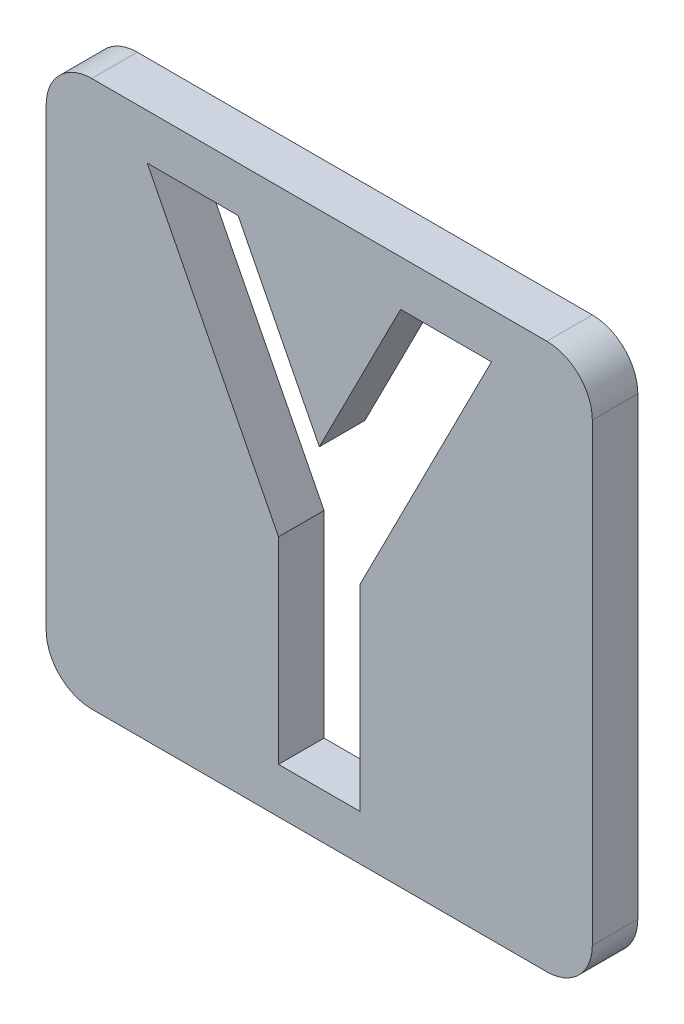
ISO-10303-21;
HEADER;
FILE_DESCRIPTION(('STEP AP214'),'2;1');
FILE_NAME('part.step','',(''),(''),'','','');
FILE_SCHEMA(('AUTOMOTIVE_DESIGN { 1 0 10303 214 1 1 1 1 }'));
ENDSEC;
DATA;
#1=APPLICATION_CONTEXT('core data for automotive mechanical design processes');
#2=APPLICATION_PROTOCOL_DEFINITION('international standard','automotive_design',2000,#1);
#3=PRODUCT_CONTEXT('',#1,'mechanical');
#4=PRODUCT('Part','Part','',(#3));
#5=PRODUCT_RELATED_PRODUCT_CATEGORY('part','',(#4));
#6=PRODUCT_DEFINITION_FORMATION('','',#4);
#7=PRODUCT_DEFINITION_CONTEXT('part definition',#1,'design');
#8=PRODUCT_DEFINITION('design','',#6,#7);
#9=PRODUCT_DEFINITION_SHAPE('','',#8);
#10=(LENGTH_UNIT() NAMED_UNIT(*) SI_UNIT(.MILLI.,.METRE.));
#11=(NAMED_UNIT(*) PLANE_ANGLE_UNIT() SI_UNIT($,.RADIAN.));
#12=(NAMED_UNIT(*) SI_UNIT($,.STERADIAN.) SOLID_ANGLE_UNIT());
#13=UNCERTAINTY_MEASURE_WITH_UNIT(LENGTH_MEASURE(1.E-05),#10,'distance_accuracy_value','');
#14=(GEOMETRIC_REPRESENTATION_CONTEXT(3) GLOBAL_UNCERTAINTY_ASSIGNED_CONTEXT((#13)) GLOBAL_UNIT_ASSIGNED_CONTEXT((#10,
#11,#12)) REPRESENTATION_CONTEXT('',''));
#15=CARTESIAN_POINT('',(0.,0.,0.));
#16=DIRECTION('',(0.,0.,1.));
#17=DIRECTION('',(1.,0.,0.));
#18=AXIS2_PLACEMENT_3D('',#15,#16,#17);
#19=CARTESIAN_POINT('',(50.,50.,10.));
#20=DIRECTION('',(0.,0.,-1.));
#21=DIRECTION('',(-1.,0.,0.));
#22=AXIS2_PLACEMENT_3D('',#19,#20,#21);
#23=PLANE('',#22);
#24=DIRECTION('',(1.,0.,0.));
#25=VECTOR('',#24,1.);
#26=CARTESIAN_POINT('',(-49.9999999999999,60.,10.));
#27=LINE('',#26,#25);
#28=CARTESIAN_POINT('',(-49.9999999999999,60.,10.));
#29=VERTEX_POINT('',#28);
#30=CARTESIAN_POINT('',(49.9999999999999,60.,10.));
#31=VERTEX_POINT('',#30);
#32=EDGE_CURVE('E226',#29,#31,#27,.T.);
#33=ORIENTED_EDGE('',*,*,#32,.F.);
#34=CARTESIAN_POINT('',(-50.,50.,10.));
#35=DIRECTION('',(0.,0.,1.));
#36=DIRECTION('',(1.,0.,0.));
#37=AXIS2_PLACEMENT_3D('',#34,#35,#36);
#38=CIRCLE('',#37,10.);
#39=CARTESIAN_POINT('',(-60.,49.9999999999999,10.));
#40=VERTEX_POINT('',#39);
#41=EDGE_CURVE('E244',#29,#40,#38,.T.);
#42=ORIENTED_EDGE('',*,*,#41,.T.);
#43=DIRECTION('',(0.,-1.,0.));
#44=VECTOR('',#43,1.);
#45=CARTESIAN_POINT('',(-60.,49.9999999999999,10.));
#46=LINE('',#45,#44);
#47=CARTESIAN_POINT('',(-60.,-49.9999999999999,10.));
#48=VERTEX_POINT('',#47);
#49=EDGE_CURVE('E242',#40,#48,#46,.T.);
#50=ORIENTED_EDGE('',*,*,#49,.T.);
#51=CARTESIAN_POINT('',(-50.,-50.,10.));
#52=DIRECTION('',(0.,0.,1.));
#53=DIRECTION('',(1.,0.,0.));
#54=AXIS2_PLACEMENT_3D('',#51,#52,#53);
#55=CIRCLE('',#54,10.);
#56=CARTESIAN_POINT('',(-49.9999999999999,-60.,10.));
#57=VERTEX_POINT('',#56);
#58=EDGE_CURVE('E240',#48,#57,#55,.T.);
#59=ORIENTED_EDGE('',*,*,#58,.T.);
#60=DIRECTION('',(1.,0.,0.));
#61=VECTOR('',#60,1.);
#62=CARTESIAN_POINT('',(-49.9999999999999,-60.,10.));
#63=LINE('',#62,#61);
#64=CARTESIAN_POINT('',(49.9999999999999,-60.,10.));
#65=VERTEX_POINT('',#64);
#66=EDGE_CURVE('E238',#57,#65,#63,.T.);
#67=ORIENTED_EDGE('',*,*,#66,.T.);
#68=CARTESIAN_POINT('',(50.,-50.,10.));
#69=DIRECTION('',(0.,0.,1.));
#70=DIRECTION('',(1.,0.,0.));
#71=AXIS2_PLACEMENT_3D('',#68,#69,#70);
#72=CIRCLE('',#71,10.);
#73=CARTESIAN_POINT('',(60.,-50.,10.));
#74=VERTEX_POINT('',#73);
#75=EDGE_CURVE('E236',#65,#74,#72,.T.);
#76=ORIENTED_EDGE('',*,*,#75,.T.);
#77=DIRECTION('',(0.,-1.,0.));
#78=VECTOR('',#77,1.);
#79=CARTESIAN_POINT('',(60.,49.9999999999999,10.));
#80=LINE('',#79,#78);
#81=CARTESIAN_POINT('',(60.,49.9999999999999,10.));
#82=VERTEX_POINT('',#81);
#83=EDGE_CURVE('E233',#82,#74,#80,.T.);
#84=ORIENTED_EDGE('',*,*,#83,.F.);
#85=CARTESIAN_POINT('',(50.,50.,10.));
#86=DIRECTION('',(0.,0.,-1.));
#87=DIRECTION('',(-1.,0.,0.));
#88=AXIS2_PLACEMENT_3D('',#85,#86,#87);
#89=CIRCLE('',#88,10.);
#90=EDGE_CURVE('E229',#31,#82,#89,.T.);
#91=ORIENTED_EDGE('',*,*,#90,.F.);
#92=EDGE_LOOP('',(#33,#42,#50,#59,#67,#76,#84,#91));
#93=FACE_BOUND('',#92,.T.);
#94=DIRECTION('',(-0.453501133357851,0.891255699585222,0.));
#95=VECTOR('',#94,1.);
#96=CARTESIAN_POINT('',(-8.94871794871795,-6.69070512820513,10.));
#97=LINE('',#96,#95);
#98=CARTESIAN_POINT('',(-8.94871794871795,-6.69070512820513,10.));
#99=VERTEX_POINT('',#98);
#100=CARTESIAN_POINT('',(-37.7948717948718,50.,10.));
#101=VERTEX_POINT('',#100);
#102=EDGE_CURVE('E50',#99,#101,#97,.T.);
#103=ORIENTED_EDGE('',*,*,#102,.T.);
#104=DIRECTION('',(1.,0.,0.));
#105=VECTOR('',#104,1.);
#106=CARTESIAN_POINT('',(-37.7948717948718,50.,10.));
#107=LINE('',#106,#105);
#108=CARTESIAN_POINT('',(-17.8229166666667,50.,10.));
#109=VERTEX_POINT('',#108);
#110=EDGE_CURVE('E168',#101,#109,#107,.T.);
#111=ORIENTED_EDGE('',*,*,#110,.T.);
#112=DIRECTION('',(0.453513991318912,-0.891249156901699,0.));
#113=VECTOR('',#112,1.);
#114=CARTESIAN_POINT('',(-17.8229166666667,50.,10.));
#115=LINE('',#114,#113);
#116=CARTESIAN_POINT('',(0.0256410256410239,14.9238782051282,10.));
#117=VERTEX_POINT('',#116);
#118=EDGE_CURVE('E193',#109,#117,#115,.T.);
#119=ORIENTED_EDGE('',*,*,#118,.T.);
#120=DIRECTION('',(0.453513991318912,0.891249156901699,0.));
#121=VECTOR('',#120,1.);
#122=CARTESIAN_POINT('',(0.0256410256410239,14.9238782051282,10.));
#123=LINE('',#122,#121);
#124=CARTESIAN_POINT('',(17.8741987179487,50.,10.));
#125=VERTEX_POINT('',#124);
#126=EDGE_CURVE('E196',#117,#125,#123,.T.);
#127=ORIENTED_EDGE('',*,*,#126,.T.);
#128=DIRECTION('',(1.,0.,0.));
#129=VECTOR('',#128,1.);
#130=CARTESIAN_POINT('',(17.8741987179487,50.,10.));
#131=LINE('',#130,#129);
#132=CARTESIAN_POINT('',(37.8461538461538,50.,10.));
#133=VERTEX_POINT('',#132);
#134=EDGE_CURVE('E199',#125,#133,#131,.T.);
#135=ORIENTED_EDGE('',*,*,#134,.T.);
#136=DIRECTION('',(-0.453501133357851,-0.891255699585222,0.));
#137=VECTOR('',#136,1.);
#138=CARTESIAN_POINT('',(37.8461538461538,50.,10.));
#139=LINE('',#138,#137);
#140=CARTESIAN_POINT('',(9.,-6.69070512820513,10.));
#141=VERTEX_POINT('',#140);
#142=EDGE_CURVE('E202',#133,#141,#139,.T.);
#143=ORIENTED_EDGE('',*,*,#142,.T.);
#144=DIRECTION('',(0.,-1.,0.));
#145=VECTOR('',#144,1.);
#146=CARTESIAN_POINT('',(9.,-6.69070512820513,10.));
#147=LINE('',#146,#145);
#148=CARTESIAN_POINT('',(9.,-50.,10.));
#149=VERTEX_POINT('',#148);
#150=EDGE_CURVE('E205',#141,#149,#147,.T.);
#151=ORIENTED_EDGE('',*,*,#150,.T.);
#152=DIRECTION('',(-1.,0.,0.));
#153=VECTOR('',#152,1.);
#154=CARTESIAN_POINT('',(9.,-50.,10.));
#155=LINE('',#154,#153);
#156=CARTESIAN_POINT('',(-8.94871794871795,-50.,10.));
#157=VERTEX_POINT('',#156);
#158=EDGE_CURVE('E208',#149,#157,#155,.T.);
#159=ORIENTED_EDGE('',*,*,#158,.T.);
#160=DIRECTION('',(0.,1.,0.));
#161=VECTOR('',#160,1.);
#162=CARTESIAN_POINT('',(-8.94871794871795,-50.,10.));
#163=LINE('',#162,#161);
#164=EDGE_CURVE('E162',#157,#99,#163,.T.);
#165=ORIENTED_EDGE('',*,*,#164,.T.);
#166=EDGE_LOOP('',(#103,#111,#119,#127,#135,#143,#151,#159,#165));
#167=FACE_BOUND('',#166,.T.);
#168=ADVANCED_FACE('F33',(#93,#167),#23,.F.);
#169=CARTESIAN_POINT('',(50.,50.,0.));
#170=DIRECTION('',(0.,0.,-1.));
#171=DIRECTION('',(-1.,0.,0.));
#172=AXIS2_PLACEMENT_3D('',#169,#170,#171);
#173=PLANE('',#172);
#174=DIRECTION('',(1.,0.,0.));
#175=VECTOR('',#174,1.);
#176=CARTESIAN_POINT('',(-49.9999999999999,60.,0.));
#177=LINE('',#176,#175);
#178=CARTESIAN_POINT('',(-49.9999999999999,60.,0.));
#179=VERTEX_POINT('',#178);
#180=CARTESIAN_POINT('',(49.9999999999999,60.,0.));
#181=VERTEX_POINT('',#180);
#182=EDGE_CURVE('E169',#179,#181,#177,.T.);
#183=ORIENTED_EDGE('',*,*,#182,.T.);
#184=CARTESIAN_POINT('',(50.,50.,0.));
#185=DIRECTION('',(0.,0.,-1.));
#186=DIRECTION('',(-1.,0.,0.));
#187=AXIS2_PLACEMENT_3D('',#184,#185,#186);
#188=CIRCLE('',#187,10.);
#189=CARTESIAN_POINT('',(60.,49.9999999999999,0.));
#190=VERTEX_POINT('',#189);
#191=EDGE_CURVE('E248',#181,#190,#188,.T.);
#192=ORIENTED_EDGE('',*,*,#191,.T.);
#193=DIRECTION('',(0.,-1.,0.));
#194=VECTOR('',#193,1.);
#195=CARTESIAN_POINT('',(60.,49.9999999999999,0.));
#196=LINE('',#195,#194);
#197=CARTESIAN_POINT('',(60.,-50.,0.));
#198=VERTEX_POINT('',#197);
#199=EDGE_CURVE('E251',#190,#198,#196,.T.);
#200=ORIENTED_EDGE('',*,*,#199,.T.);
#201=CARTESIAN_POINT('',(50.,-50.,0.));
#202=DIRECTION('',(0.,0.,1.));
#203=DIRECTION('',(1.,0.,0.));
#204=AXIS2_PLACEMENT_3D('',#201,#202,#203);
#205=CIRCLE('',#204,10.);
#206=CARTESIAN_POINT('',(49.9999999999999,-60.,0.));
#207=VERTEX_POINT('',#206);
#208=EDGE_CURVE('E254',#207,#198,#205,.T.);
#209=ORIENTED_EDGE('',*,*,#208,.F.);
#210=DIRECTION('',(1.,0.,0.));
#211=VECTOR('',#210,1.);
#212=CARTESIAN_POINT('',(-49.9999999999999,-60.,0.));
#213=LINE('',#212,#211);
#214=CARTESIAN_POINT('',(-49.9999999999999,-60.,0.));
#215=VERTEX_POINT('',#214);
#216=EDGE_CURVE('E257',#215,#207,#213,.T.);
#217=ORIENTED_EDGE('',*,*,#216,.F.);
#218=CARTESIAN_POINT('',(-50.,-50.,0.));
#219=DIRECTION('',(0.,0.,1.));
#220=DIRECTION('',(1.,0.,0.));
#221=AXIS2_PLACEMENT_3D('',#218,#219,#220);
#222=CIRCLE('',#221,10.);
#223=CARTESIAN_POINT('',(-60.,-49.9999999999999,0.));
#224=VERTEX_POINT('',#223);
#225=EDGE_CURVE('E259',#224,#215,#222,.T.);
#226=ORIENTED_EDGE('',*,*,#225,.F.);
#227=DIRECTION('',(0.,-1.,0.));
#228=VECTOR('',#227,1.);
#229=CARTESIAN_POINT('',(-60.,49.9999999999999,0.));
#230=LINE('',#229,#228);
#231=CARTESIAN_POINT('',(-60.,49.9999999999999,0.));
#232=VERTEX_POINT('',#231);
#233=EDGE_CURVE('E261',#232,#224,#230,.T.);
#234=ORIENTED_EDGE('',*,*,#233,.F.);
#235=CARTESIAN_POINT('',(-50.,50.,0.));
#236=DIRECTION('',(0.,0.,1.));
#237=DIRECTION('',(1.,0.,0.));
#238=AXIS2_PLACEMENT_3D('',#235,#236,#237);
#239=CIRCLE('',#238,10.);
#240=EDGE_CURVE('E230',#179,#232,#239,.T.);
#241=ORIENTED_EDGE('',*,*,#240,.F.);
#242=EDGE_LOOP('',(#183,#192,#200,#209,#217,#226,#234,#241));
#243=FACE_BOUND('',#242,.T.);
#244=DIRECTION('',(1.,0.,0.));
#245=VECTOR('',#244,1.);
#246=CARTESIAN_POINT('',(-37.7948717948718,50.,0.));
#247=LINE('',#246,#245);
#248=CARTESIAN_POINT('',(-37.7948717948718,50.,0.));
#249=VERTEX_POINT('',#248);
#250=CARTESIAN_POINT('',(-17.8229166666667,50.,0.));
#251=VERTEX_POINT('',#250);
#252=EDGE_CURVE('E161',#249,#251,#247,.T.);
#253=ORIENTED_EDGE('',*,*,#252,.F.);
#254=DIRECTION('',(-0.453501133357851,0.891255699585222,0.));
#255=VECTOR('',#254,1.);
#256=CARTESIAN_POINT('',(-8.94871794871795,-6.69070512820513,0.));
#257=LINE('',#256,#255);
#258=CARTESIAN_POINT('',(-8.94871794871795,-6.69070512820513,0.));
#259=VERTEX_POINT('',#258);
#260=EDGE_CURVE('E153',#259,#249,#257,.T.);
#261=ORIENTED_EDGE('',*,*,#260,.F.);
#262=DIRECTION('',(0.,1.,0.));
#263=VECTOR('',#262,1.);
#264=CARTESIAN_POINT('',(-8.94871794871795,-50.,0.));
#265=LINE('',#264,#263);
#266=CARTESIAN_POINT('',(-8.94871794871795,-50.,0.));
#267=VERTEX_POINT('',#266);
#268=EDGE_CURVE('E189',#267,#259,#265,.T.);
#269=ORIENTED_EDGE('',*,*,#268,.F.);
#270=DIRECTION('',(-1.,0.,0.));
#271=VECTOR('',#270,1.);
#272=CARTESIAN_POINT('',(9.,-50.,0.));
#273=LINE('',#272,#271);
#274=CARTESIAN_POINT('',(9.,-50.,0.));
#275=VERTEX_POINT('',#274);
#276=EDGE_CURVE('E187',#275,#267,#273,.T.);
#277=ORIENTED_EDGE('',*,*,#276,.F.);
#278=DIRECTION('',(0.,-1.,0.));
#279=VECTOR('',#278,1.);
#280=CARTESIAN_POINT('',(9.,-6.69070512820513,0.));
#281=LINE('',#280,#279);
#282=CARTESIAN_POINT('',(9.,-6.69070512820513,0.));
#283=VERTEX_POINT('',#282);
#284=EDGE_CURVE('E185',#283,#275,#281,.T.);
#285=ORIENTED_EDGE('',*,*,#284,.F.);
#286=DIRECTION('',(-0.453501133357851,-0.891255699585222,0.));
#287=VECTOR('',#286,1.);
#288=CARTESIAN_POINT('',(37.8461538461538,50.,0.));
#289=LINE('',#288,#287);
#290=CARTESIAN_POINT('',(37.8461538461538,50.,0.));
#291=VERTEX_POINT('',#290);
#292=EDGE_CURVE('E183',#291,#283,#289,.T.);
#293=ORIENTED_EDGE('',*,*,#292,.F.);
#294=DIRECTION('',(1.,0.,0.));
#295=VECTOR('',#294,1.);
#296=CARTESIAN_POINT('',(17.8741987179487,50.,0.));
#297=LINE('',#296,#295);
#298=CARTESIAN_POINT('',(17.8741987179487,50.,0.));
#299=VERTEX_POINT('',#298);
#300=EDGE_CURVE('E181',#299,#291,#297,.T.);
#301=ORIENTED_EDGE('',*,*,#300,.F.);
#302=DIRECTION('',(0.453513991318912,0.891249156901699,0.));
#303=VECTOR('',#302,1.);
#304=CARTESIAN_POINT('',(0.0256410256410239,14.9238782051282,0.));
#305=LINE('',#304,#303);
#306=CARTESIAN_POINT('',(0.0256410256410239,14.9238782051282,0.));
#307=VERTEX_POINT('',#306);
#308=EDGE_CURVE('E177',#307,#299,#305,.T.);
#309=ORIENTED_EDGE('',*,*,#308,.F.);
#310=DIRECTION('',(0.453513991318912,-0.891249156901699,0.));
#311=VECTOR('',#310,1.);
#312=CARTESIAN_POINT('',(-17.8229166666667,50.,0.));
#313=LINE('',#312,#311);
#314=EDGE_CURVE('E175',#251,#307,#313,.T.);
#315=ORIENTED_EDGE('',*,*,#314,.F.);
#316=EDGE_LOOP('',(#253,#261,#269,#277,#285,#293,#301,#309,#315));
#317=FACE_BOUND('',#316,.T.);
#318=ADVANCED_FACE('F173',(#243,#317),#173,.T.);
#319=CARTESIAN_POINT('',(-49.9999999999999,60.,10.));
#320=DIRECTION('',(0.,1.,0.));
#321=DIRECTION('',(0.,0.,1.));
#322=AXIS2_PLACEMENT_3D('',#319,#320,#321);
#323=PLANE('',#322);
#324=ORIENTED_EDGE('',*,*,#182,.F.);
#325=DIRECTION('',(0.,0.,-1.));
#326=VECTOR('',#325,1.);
#327=CARTESIAN_POINT('',(-49.9999999999999,60.,10.));
#328=LINE('',#327,#326);
#329=EDGE_CURVE('E11',#29,#179,#328,.T.);
#330=ORIENTED_EDGE('',*,*,#329,.F.);
#331=ORIENTED_EDGE('',*,*,#32,.T.);
#332=DIRECTION('',(0.,0.,-1.));
#333=VECTOR('',#332,1.);
#334=CARTESIAN_POINT('',(49.9999999999999,60.,10.));
#335=LINE('',#334,#333);
#336=EDGE_CURVE('E37',#31,#181,#335,.T.);
#337=ORIENTED_EDGE('',*,*,#336,.T.);
#338=EDGE_LOOP('',(#324,#330,#331,#337));
#339=FACE_BOUND('',#338,.T.);
#340=ADVANCED_FACE('F35',(#339),#323,.T.);
#341=CARTESIAN_POINT('',(-50.,50.,10.));
#342=DIRECTION('',(0.,0.,-1.));
#343=DIRECTION('',(-1.,0.,0.));
#344=AXIS2_PLACEMENT_3D('',#341,#342,#343);
#345=CYLINDRICAL_SURFACE('',#344,10.);
#346=ORIENTED_EDGE('',*,*,#240,.T.);
#347=DIRECTION('',(0.,0.,-1.));
#348=VECTOR('',#347,1.);
#349=CARTESIAN_POINT('',(-60.,49.9999999999999,10.));
#350=LINE('',#349,#348);
#351=EDGE_CURVE('E42',#40,#232,#350,.T.);
#352=ORIENTED_EDGE('',*,*,#351,.F.);
#353=ORIENTED_EDGE('',*,*,#41,.F.);
#354=ORIENTED_EDGE('',*,*,#329,.T.);
#355=EDGE_LOOP('',(#346,#352,#353,#354));
#356=FACE_BOUND('',#355,.T.);
#357=ADVANCED_FACE('F291',(#356),#345,.T.);
#358=CARTESIAN_POINT('',(-60.,49.9999999999999,10.));
#359=DIRECTION('',(1.,0.,0.));
#360=DIRECTION('',(0.,1.,0.));
#361=AXIS2_PLACEMENT_3D('',#358,#359,#360);
#362=PLANE('',#361);
#363=ORIENTED_EDGE('',*,*,#233,.T.);
#364=DIRECTION('',(0.,0.,-1.));
#365=VECTOR('',#364,1.);
#366=CARTESIAN_POINT('',(-60.,-49.9999999999999,10.));
#367=LINE('',#366,#365);
#368=EDGE_CURVE('E266',#48,#224,#367,.T.);
#369=ORIENTED_EDGE('',*,*,#368,.F.);
#370=ORIENTED_EDGE('',*,*,#49,.F.);
#371=ORIENTED_EDGE('',*,*,#351,.T.);
#372=EDGE_LOOP('',(#363,#369,#370,#371));
#373=FACE_BOUND('',#372,.T.);
#374=ADVANCED_FACE('F295',(#373),#362,.F.);
#375=CARTESIAN_POINT('',(-50.,-50.,10.));
#376=DIRECTION('',(0.,0.,-1.));
#377=DIRECTION('',(-1.,0.,0.));
#378=AXIS2_PLACEMENT_3D('',#375,#376,#377);
#379=CYLINDRICAL_SURFACE('',#378,10.);
#380=ORIENTED_EDGE('',*,*,#225,.T.);
#381=DIRECTION('',(0.,0.,-1.));
#382=VECTOR('',#381,1.);
#383=CARTESIAN_POINT('',(-49.9999999999999,-60.,10.));
#384=LINE('',#383,#382);
#385=EDGE_CURVE('E269',#57,#215,#384,.T.);
#386=ORIENTED_EDGE('',*,*,#385,.F.);
#387=ORIENTED_EDGE('',*,*,#58,.F.);
#388=ORIENTED_EDGE('',*,*,#368,.T.);
#389=EDGE_LOOP('',(#380,#386,#387,#388));
#390=FACE_BOUND('',#389,.T.);
#391=ADVANCED_FACE('F315',(#390),#379,.T.);
#392=CARTESIAN_POINT('',(-49.9999999999999,-60.,10.));
#393=DIRECTION('',(0.,1.,0.));
#394=DIRECTION('',(0.,0.,1.));
#395=AXIS2_PLACEMENT_3D('',#392,#393,#394);
#396=PLANE('',#395);
#397=ORIENTED_EDGE('',*,*,#216,.T.);
#398=DIRECTION('',(0.,0.,-1.));
#399=VECTOR('',#398,1.);
#400=CARTESIAN_POINT('',(49.9999999999999,-60.,10.));
#401=LINE('',#400,#399);
#402=EDGE_CURVE('E272',#65,#207,#401,.T.);
#403=ORIENTED_EDGE('',*,*,#402,.F.);
#404=ORIENTED_EDGE('',*,*,#66,.F.);
#405=ORIENTED_EDGE('',*,*,#385,.T.);
#406=EDGE_LOOP('',(#397,#403,#404,#405));
#407=FACE_BOUND('',#406,.T.);
#408=ADVANCED_FACE('F313',(#407),#396,.F.);
#409=CARTESIAN_POINT('',(50.,-50.,10.));
#410=DIRECTION('',(0.,0.,-1.));
#411=DIRECTION('',(-1.,0.,0.));
#412=AXIS2_PLACEMENT_3D('',#409,#410,#411);
#413=CYLINDRICAL_SURFACE('',#412,10.);
#414=ORIENTED_EDGE('',*,*,#208,.T.);
#415=DIRECTION('',(0.,0.,-1.));
#416=VECTOR('',#415,1.);
#417=CARTESIAN_POINT('',(60.,-50.,10.));
#418=LINE('',#417,#416);
#419=EDGE_CURVE('E275',#74,#198,#418,.T.);
#420=ORIENTED_EDGE('',*,*,#419,.F.);
#421=ORIENTED_EDGE('',*,*,#75,.F.);
#422=ORIENTED_EDGE('',*,*,#402,.T.);
#423=EDGE_LOOP('',(#414,#420,#421,#422));
#424=FACE_BOUND('',#423,.T.);
#425=ADVANCED_FACE('F309',(#424),#413,.T.);
#426=CARTESIAN_POINT('',(60.,49.9999999999999,10.));
#427=DIRECTION('',(1.,0.,0.));
#428=DIRECTION('',(0.,1.,0.));
#429=AXIS2_PLACEMENT_3D('',#426,#427,#428);
#430=PLANE('',#429);
#431=ORIENTED_EDGE('',*,*,#199,.F.);
#432=DIRECTION('',(0.,0.,-1.));
#433=VECTOR('',#432,1.);
#434=CARTESIAN_POINT('',(60.,49.9999999999999,10.));
#435=LINE('',#434,#433);
#436=EDGE_CURVE('E276',#82,#190,#435,.T.);
#437=ORIENTED_EDGE('',*,*,#436,.F.);
#438=ORIENTED_EDGE('',*,*,#83,.T.);
#439=ORIENTED_EDGE('',*,*,#419,.T.);
#440=EDGE_LOOP('',(#431,#437,#438,#439));
#441=FACE_BOUND('',#440,.T.);
#442=ADVANCED_FACE('F305',(#441),#430,.T.);
#443=CARTESIAN_POINT('',(50.,50.,10.));
#444=DIRECTION('',(0.,0.,-1.));
#445=DIRECTION('',(-1.,0.,0.));
#446=AXIS2_PLACEMENT_3D('',#443,#444,#445);
#447=CYLINDRICAL_SURFACE('',#446,10.);
#448=ORIENTED_EDGE('',*,*,#191,.F.);
#449=ORIENTED_EDGE('',*,*,#336,.F.);
#450=ORIENTED_EDGE('',*,*,#90,.T.);
#451=ORIENTED_EDGE('',*,*,#436,.T.);
#452=EDGE_LOOP('',(#448,#449,#450,#451));
#453=FACE_BOUND('',#452,.T.);
#454=ADVANCED_FACE('F284',(#453),#447,.T.);
#455=CARTESIAN_POINT('',(-8.94871794871795,-6.69070512820513,0.));
#456=DIRECTION('',(0.891255699585222,0.453501133357851,0.));
#457=DIRECTION('',(-0.453501133357851,0.891255699585222,0.));
#458=AXIS2_PLACEMENT_3D('',#455,#456,#457);
#459=PLANE('',#458);
#460=ORIENTED_EDGE('',*,*,#102,.F.);
#461=DIRECTION('',(0.,0.,1.));
#462=VECTOR('',#461,1.);
#463=CARTESIAN_POINT('',(-8.94871794871795,-6.69070512820513,0.));
#464=LINE('',#463,#462);
#465=EDGE_CURVE('E157',#259,#99,#464,.T.);
#466=ORIENTED_EDGE('',*,*,#465,.F.);
#467=ORIENTED_EDGE('',*,*,#260,.T.);
#468=DIRECTION('',(0.,0.,1.));
#469=VECTOR('',#468,1.);
#470=CARTESIAN_POINT('',(-37.7948717948718,50.,0.));
#471=LINE('',#470,#469);
#472=EDGE_CURVE('E156',#249,#101,#471,.T.);
#473=ORIENTED_EDGE('',*,*,#472,.T.);
#474=EDGE_LOOP('',(#460,#466,#467,#473));
#475=FACE_BOUND('',#474,.T.);
#476=ADVANCED_FACE('F155',(#475),#459,.T.);
#477=CARTESIAN_POINT('',(-37.7948717948718,50.,0.));
#478=DIRECTION('',(0.,-1.,0.));
#479=DIRECTION('',(0.,0.,-1.));
#480=AXIS2_PLACEMENT_3D('',#477,#478,#479);
#481=PLANE('',#480);
#482=ORIENTED_EDGE('',*,*,#110,.F.);
#483=ORIENTED_EDGE('',*,*,#472,.F.);
#484=ORIENTED_EDGE('',*,*,#252,.T.);
#485=DIRECTION('',(0.,0.,1.));
#486=VECTOR('',#485,1.);
#487=CARTESIAN_POINT('',(-17.8229166666667,50.,0.));
#488=LINE('',#487,#486);
#489=EDGE_CURVE('E170',#251,#109,#488,.T.);
#490=ORIENTED_EDGE('',*,*,#489,.T.);
#491=EDGE_LOOP('',(#482,#483,#484,#490));
#492=FACE_BOUND('',#491,.T.);
#493=ADVANCED_FACE('F165',(#492),#481,.T.);
#494=CARTESIAN_POINT('',(-17.8229166666667,50.,0.));
#495=DIRECTION('',(-0.891249156901699,-0.453513991318912,0.));
#496=DIRECTION('',(0.453513991318912,-0.891249156901699,0.));
#497=AXIS2_PLACEMENT_3D('',#494,#495,#496);
#498=PLANE('',#497);
#499=ORIENTED_EDGE('',*,*,#118,.F.);
#500=ORIENTED_EDGE('',*,*,#489,.F.);
#501=ORIENTED_EDGE('',*,*,#314,.T.);
#502=DIRECTION('',(0.,0.,1.));
#503=VECTOR('',#502,1.);
#504=CARTESIAN_POINT('',(0.0256410256410239,14.9238782051282,0.));
#505=LINE('',#504,#503);
#506=EDGE_CURVE('E223',#307,#117,#505,.T.);
#507=ORIENTED_EDGE('',*,*,#506,.T.);
#508=EDGE_LOOP('',(#499,#500,#501,#507));
#509=FACE_BOUND('',#508,.T.);
#510=ADVANCED_FACE('F364',(#509),#498,.T.);
#511=CARTESIAN_POINT('',(0.0256410256410239,14.9238782051282,0.));
#512=DIRECTION('',(0.891249156901699,-0.453513991318912,0.));
#513=DIRECTION('',(0.453513991318912,0.891249156901699,0.));
#514=AXIS2_PLACEMENT_3D('',#511,#512,#513);
#515=PLANE('',#514);
#516=ORIENTED_EDGE('',*,*,#126,.F.);
#517=ORIENTED_EDGE('',*,*,#506,.F.);
#518=ORIENTED_EDGE('',*,*,#308,.T.);
#519=DIRECTION('',(0.,0.,1.));
#520=VECTOR('',#519,1.);
#521=CARTESIAN_POINT('',(17.8741987179487,50.,0.));
#522=LINE('',#521,#520);
#523=EDGE_CURVE('E221',#299,#125,#522,.T.);
#524=ORIENTED_EDGE('',*,*,#523,.T.);
#525=EDGE_LOOP('',(#516,#517,#518,#524));
#526=FACE_BOUND('',#525,.T.);
#527=ADVANCED_FACE('F372',(#526),#515,.T.);
#528=CARTESIAN_POINT('',(17.8741987179487,50.,0.));
#529=DIRECTION('',(0.,-1.,0.));
#530=DIRECTION('',(0.,0.,-1.));
#531=AXIS2_PLACEMENT_3D('',#528,#529,#530);
#532=PLANE('',#531);
#533=ORIENTED_EDGE('',*,*,#134,.F.);
#534=ORIENTED_EDGE('',*,*,#523,.F.);
#535=ORIENTED_EDGE('',*,*,#300,.T.);
#536=DIRECTION('',(0.,0.,1.));
#537=VECTOR('',#536,1.);
#538=CARTESIAN_POINT('',(37.8461538461538,50.,0.));
#539=LINE('',#538,#537);
#540=EDGE_CURVE('E219',#291,#133,#539,.T.);
#541=ORIENTED_EDGE('',*,*,#540,.T.);
#542=EDGE_LOOP('',(#533,#534,#535,#541));
#543=FACE_BOUND('',#542,.T.);
#544=ADVANCED_FACE('F382',(#543),#532,.T.);
#545=CARTESIAN_POINT('',(37.8461538461538,50.,0.));
#546=DIRECTION('',(-0.891255699585222,0.453501133357851,0.));
#547=DIRECTION('',(-0.453501133357851,-0.891255699585222,0.));
#548=AXIS2_PLACEMENT_3D('',#545,#546,#547);
#549=PLANE('',#548);
#550=ORIENTED_EDGE('',*,*,#142,.F.);
#551=ORIENTED_EDGE('',*,*,#540,.F.);
#552=ORIENTED_EDGE('',*,*,#292,.T.);
#553=DIRECTION('',(0.,0.,1.));
#554=VECTOR('',#553,1.);
#555=CARTESIAN_POINT('',(9.,-6.69070512820513,0.));
#556=LINE('',#555,#554);
#557=EDGE_CURVE('E217',#283,#141,#556,.T.);
#558=ORIENTED_EDGE('',*,*,#557,.T.);
#559=EDGE_LOOP('',(#550,#551,#552,#558));
#560=FACE_BOUND('',#559,.T.);
#561=ADVANCED_FACE('F392',(#560),#549,.T.);
#562=CARTESIAN_POINT('',(9.,-6.69070512820513,0.));
#563=DIRECTION('',(-1.,0.,0.));
#564=DIRECTION('',(0.,0.,1.));
#565=AXIS2_PLACEMENT_3D('',#562,#563,#564);
#566=PLANE('',#565);
#567=ORIENTED_EDGE('',*,*,#150,.F.);
#568=ORIENTED_EDGE('',*,*,#557,.F.);
#569=ORIENTED_EDGE('',*,*,#284,.T.);
#570=DIRECTION('',(0.,0.,1.));
#571=VECTOR('',#570,1.);
#572=CARTESIAN_POINT('',(9.,-50.,0.));
#573=LINE('',#572,#571);
#574=EDGE_CURVE('E215',#275,#149,#573,.T.);
#575=ORIENTED_EDGE('',*,*,#574,.T.);
#576=EDGE_LOOP('',(#567,#568,#569,#575));
#577=FACE_BOUND('',#576,.T.);
#578=ADVANCED_FACE('F402',(#577),#566,.T.);
#579=CARTESIAN_POINT('',(9.,-50.,0.));
#580=DIRECTION('',(0.,1.,0.));
#581=DIRECTION('',(0.,0.,1.));
#582=AXIS2_PLACEMENT_3D('',#579,#580,#581);
#583=PLANE('',#582);
#584=ORIENTED_EDGE('',*,*,#158,.F.);
#585=ORIENTED_EDGE('',*,*,#574,.F.);
#586=ORIENTED_EDGE('',*,*,#276,.T.);
#587=DIRECTION('',(0.,0.,1.));
#588=VECTOR('',#587,1.);
#589=CARTESIAN_POINT('',(-8.94871794871795,-50.,0.));
#590=LINE('',#589,#588);
#591=EDGE_CURVE('E58',#267,#157,#590,.T.);
#592=ORIENTED_EDGE('',*,*,#591,.T.);
#593=EDGE_LOOP('',(#584,#585,#586,#592));
#594=FACE_BOUND('',#593,.T.);
#595=ADVANCED_FACE('F412',(#594),#583,.T.);
#596=CARTESIAN_POINT('',(-8.94871794871795,-50.,0.));
#597=DIRECTION('',(1.,0.,0.));
#598=DIRECTION('',(0.,0.,-1.));
#599=AXIS2_PLACEMENT_3D('',#596,#597,#598);
#600=PLANE('',#599);
#601=ORIENTED_EDGE('',*,*,#164,.F.);
#602=ORIENTED_EDGE('',*,*,#591,.F.);
#603=ORIENTED_EDGE('',*,*,#268,.T.);
#604=ORIENTED_EDGE('',*,*,#465,.T.);
#605=EDGE_LOOP('',(#601,#602,#603,#604));
#606=FACE_BOUND('',#605,.T.);
#607=ADVANCED_FACE('F422',(#606),#600,.T.);
#608=CLOSED_SHELL('',(#168,#318,#340,#357,#374,#391,#408,#425,#442,#454,#476,#493,#510,#527,
#544,#561,#578,#595,#607));
#609=MANIFOLD_SOLID_BREP('B2',#608);
#610=ADVANCED_BREP_SHAPE_REPRESENTATION('',(#18,#609),#14);
#611=SHAPE_DEFINITION_REPRESENTATION(#9,#610);
ENDSEC;
END-ISO-10303-21;
